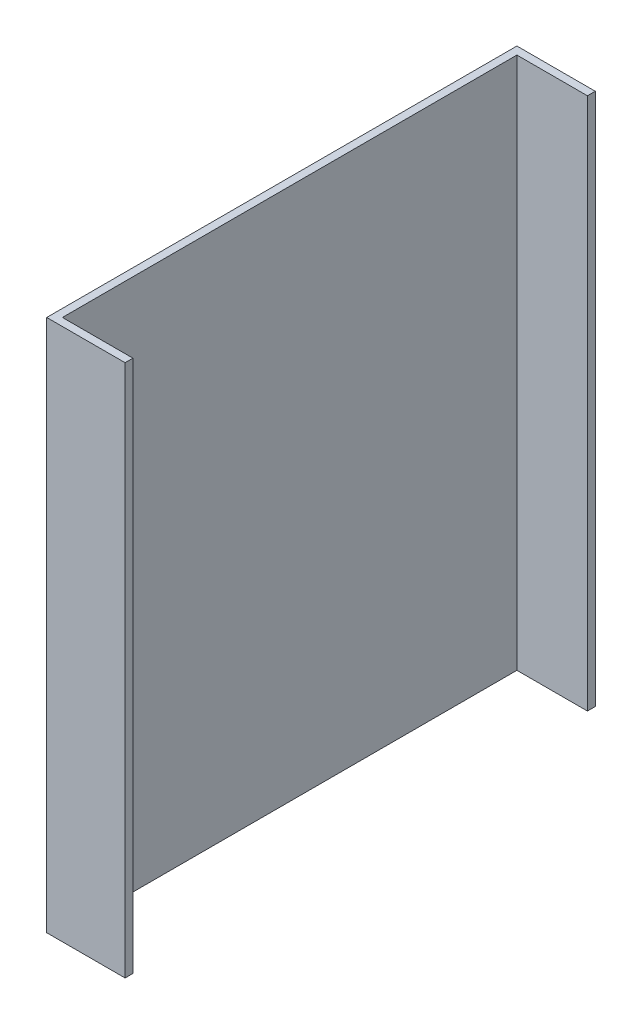
ISO-10303-21;
HEADER;
FILE_DESCRIPTION(('STEP AP214'),'2;1');
FILE_NAME('part.step','',(''),(''),'','','');
FILE_SCHEMA(('AUTOMOTIVE_DESIGN { 1 0 10303 214 1 1 1 1 }'));
ENDSEC;
DATA;
#1=APPLICATION_CONTEXT('core data for automotive mechanical design processes');
#2=APPLICATION_PROTOCOL_DEFINITION('international standard','automotive_design',2000,#1);
#3=PRODUCT_CONTEXT('',#1,'mechanical');
#4=PRODUCT('Part','Part','',(#3));
#5=PRODUCT_RELATED_PRODUCT_CATEGORY('part','',(#4));
#6=PRODUCT_DEFINITION_FORMATION('','',#4);
#7=PRODUCT_DEFINITION_CONTEXT('part definition',#1,'design');
#8=PRODUCT_DEFINITION('design','',#6,#7);
#9=PRODUCT_DEFINITION_SHAPE('','',#8);
#10=(LENGTH_UNIT() NAMED_UNIT(*) SI_UNIT(.MILLI.,.METRE.));
#11=(NAMED_UNIT(*) PLANE_ANGLE_UNIT() SI_UNIT($,.RADIAN.));
#12=(NAMED_UNIT(*) SI_UNIT($,.STERADIAN.) SOLID_ANGLE_UNIT());
#13=UNCERTAINTY_MEASURE_WITH_UNIT(LENGTH_MEASURE(1.E-05),#10,'distance_accuracy_value','');
#14=(GEOMETRIC_REPRESENTATION_CONTEXT(3) GLOBAL_UNCERTAINTY_ASSIGNED_CONTEXT((#13)) GLOBAL_UNIT_ASSIGNED_CONTEXT((#10,
#11,#12)) REPRESENTATION_CONTEXT('',''));
#15=CARTESIAN_POINT('',(0.,0.,0.));
#16=DIRECTION('',(0.,0.,1.));
#17=DIRECTION('',(1.,0.,0.));
#18=AXIS2_PLACEMENT_3D('',#15,#16,#17);
#19=CARTESIAN_POINT('',(32.6228000000035,-43.7918200006,1.19916001190173));
#20=DIRECTION('',(1.02069463991939E-11,1.,5.10341196927923E-12));
#21=DIRECTION('',(0.,5.10341196927923E-12,-1.));
#22=AXIS2_PLACEMENT_3D('',#19,#20,#21);
#23=PLANE('',#22);
#24=DIRECTION('',(-1.,1.02069463991939E-11,0.));
#25=VECTOR('',#24,1.);
#26=CARTESIAN_POINT('',(31.8078000000034,-43.7918200005902,0.909160011901735));
#27=LINE('',#26,#25);
#28=CARTESIAN_POINT('',(31.8978000000034,-43.7918200005912,0.909160011901735));
#29=VERTEX_POINT('',#28);
#30=CARTESIAN_POINT('',(31.8078000000034,-43.7918200005902,0.909160011901735));
#31=VERTEX_POINT('',#30);
#32=EDGE_CURVE('E181',#29,#31,#27,.T.);
#33=ORIENTED_EDGE('',*,*,#32,.F.);
#34=DIRECTION('',(0.,-5.10341196927923E-12,1.));
#35=VECTOR('',#34,1.);
#36=CARTESIAN_POINT('',(31.8978000000034,-43.7918200005912,0.909160011901735));
#37=LINE('',#36,#35);
#38=CARTESIAN_POINT('',(31.8978000000034,-43.7918200005911,0.899160011901735));
#39=VERTEX_POINT('',#38);
#40=EDGE_CURVE('E27',#39,#29,#37,.T.);
#41=ORIENTED_EDGE('',*,*,#40,.F.);
#42=DIRECTION('',(1.,-1.02069463991939E-11,0.));
#43=VECTOR('',#42,1.);
#44=CARTESIAN_POINT('',(31.8978000000034,-43.7918200005911,0.899160011901735));
#45=LINE('',#44,#43);
#46=CARTESIAN_POINT('',(31.7978000000034,-43.7918200005901,0.899160011901735));
#47=VERTEX_POINT('',#46);
#48=EDGE_CURVE('E143',#47,#39,#45,.T.);
#49=ORIENTED_EDGE('',*,*,#48,.F.);
#50=DIRECTION('',(0.,5.10341196927923E-12,-1.));
#51=VECTOR('',#50,1.);
#52=CARTESIAN_POINT('',(31.7978000000034,-43.7918200005901,0.899160011901735));
#53=LINE('',#52,#51);
#54=CARTESIAN_POINT('',(31.7978000000034,-43.7918200005931,1.49916001190173));
#55=VERTEX_POINT('',#54);
#56=EDGE_CURVE('E113',#55,#47,#53,.T.);
#57=ORIENTED_EDGE('',*,*,#56,.F.);
#58=DIRECTION('',(-1.,1.02069463991939E-11,0.));
#59=VECTOR('',#58,1.);
#60=CARTESIAN_POINT('',(31.7978000000034,-43.7918200005931,1.49916001190173));
#61=LINE('',#60,#59);
#62=CARTESIAN_POINT('',(31.8978000000034,-43.7918200005942,1.49916001190173));
#63=VERTEX_POINT('',#62);
#64=EDGE_CURVE('E208',#63,#55,#61,.T.);
#65=ORIENTED_EDGE('',*,*,#64,.F.);
#66=DIRECTION('',(0.,-5.10341196927934E-12,1.));
#67=VECTOR('',#66,1.);
#68=CARTESIAN_POINT('',(31.8978000000034,-43.7918200005942,1.49916001190173));
#69=LINE('',#68,#67);
#70=CARTESIAN_POINT('',(31.8978000000034,-43.7918200005941,1.48916001190173));
#71=VERTEX_POINT('',#70);
#72=EDGE_CURVE('E158',#71,#63,#69,.T.);
#73=ORIENTED_EDGE('',*,*,#72,.F.);
#74=DIRECTION('',(1.,-1.02069463991939E-11,0.));
#75=VECTOR('',#74,1.);
#76=CARTESIAN_POINT('',(31.8978000000034,-43.7918200005941,1.48916001190173));
#77=LINE('',#76,#75);
#78=CARTESIAN_POINT('',(31.8078000000034,-43.7918200005932,1.48916001190173));
#79=VERTEX_POINT('',#78);
#80=EDGE_CURVE('E170',#79,#71,#77,.T.);
#81=ORIENTED_EDGE('',*,*,#80,.F.);
#82=DIRECTION('',(0.,-5.10341196927923E-12,1.));
#83=VECTOR('',#82,1.);
#84=CARTESIAN_POINT('',(31.8078000000034,-43.7918200005932,1.48916001190173));
#85=LINE('',#84,#83);
#86=EDGE_CURVE('E80',#31,#79,#85,.T.);
#87=ORIENTED_EDGE('',*,*,#86,.F.);
#88=EDGE_LOOP('',(#33,#41,#49,#57,#65,#73,#81,#87));
#89=FACE_BOUND('',#88,.T.);
#90=ADVANCED_FACE('F16',(#89),#23,.T.);
#91=CARTESIAN_POINT('',(32.6227999999966,-44.4718200006,1.19916001189826));
#92=DIRECTION('',(1.02069463991939E-11,1.,5.10341196927923E-12));
#93=DIRECTION('',(0.,5.10341196927923E-12,-1.));
#94=AXIS2_PLACEMENT_3D('',#91,#92,#93);
#95=PLANE('',#94);
#96=DIRECTION('',(-1.,1.02069463991939E-11,0.));
#97=VECTOR('',#96,1.);
#98=CARTESIAN_POINT('',(31.8077999999966,-44.4718200005902,0.909160011898265));
#99=LINE('',#98,#97);
#100=CARTESIAN_POINT('',(31.8977999999966,-44.4718200005912,0.909160011898265));
#101=VERTEX_POINT('',#100);
#102=CARTESIAN_POINT('',(31.8077999999966,-44.4718200005902,0.909160011898265));
#103=VERTEX_POINT('',#102);
#104=EDGE_CURVE('E184',#101,#103,#99,.T.);
#105=ORIENTED_EDGE('',*,*,#104,.T.);
#106=DIRECTION('',(0.,-5.10341196927923E-12,1.));
#107=VECTOR('',#106,1.);
#108=CARTESIAN_POINT('',(31.8077999999966,-44.4718200005932,1.48916001189826));
#109=LINE('',#108,#107);
#110=CARTESIAN_POINT('',(31.8077999999966,-44.4718200005932,1.48916001189826));
#111=VERTEX_POINT('',#110);
#112=EDGE_CURVE('E65',#103,#111,#109,.T.);
#113=ORIENTED_EDGE('',*,*,#112,.T.);
#114=DIRECTION('',(1.,-1.02069463991939E-11,0.));
#115=VECTOR('',#114,1.);
#116=CARTESIAN_POINT('',(31.8977999999966,-44.4718200005941,1.48916001189826));
#117=LINE('',#116,#115);
#118=CARTESIAN_POINT('',(31.8977999999966,-44.4718200005941,1.48916001189826));
#119=VERTEX_POINT('',#118);
#120=EDGE_CURVE('E156',#111,#119,#117,.T.);
#121=ORIENTED_EDGE('',*,*,#120,.T.);
#122=DIRECTION('',(0.,-5.10341196927934E-12,1.));
#123=VECTOR('',#122,1.);
#124=CARTESIAN_POINT('',(31.8977999999966,-44.4718200005941,1.49916001189826));
#125=LINE('',#124,#123);
#126=CARTESIAN_POINT('',(31.8977999999966,-44.4718200005941,1.49916001189826));
#127=VERTEX_POINT('',#126);
#128=EDGE_CURVE('E205',#119,#127,#125,.T.);
#129=ORIENTED_EDGE('',*,*,#128,.T.);
#130=DIRECTION('',(-1.,1.02069463991939E-11,0.));
#131=VECTOR('',#130,1.);
#132=CARTESIAN_POINT('',(31.7977999999966,-44.4718200005931,1.49916001189826));
#133=LINE('',#132,#131);
#134=CARTESIAN_POINT('',(31.7977999999966,-44.4718200005931,1.49916001189826));
#135=VERTEX_POINT('',#134);
#136=EDGE_CURVE('E124',#127,#135,#133,.T.);
#137=ORIENTED_EDGE('',*,*,#136,.T.);
#138=DIRECTION('',(0.,5.10341196927923E-12,-1.));
#139=VECTOR('',#138,1.);
#140=CARTESIAN_POINT('',(31.7977999999966,-44.47182000059,0.899160011898265));
#141=LINE('',#140,#139);
#142=CARTESIAN_POINT('',(31.7977999999966,-44.47182000059,0.899160011898265));
#143=VERTEX_POINT('',#142);
#144=EDGE_CURVE('E105',#135,#143,#141,.T.);
#145=ORIENTED_EDGE('',*,*,#144,.T.);
#146=DIRECTION('',(1.,-1.02069463991939E-11,0.));
#147=VECTOR('',#146,1.);
#148=CARTESIAN_POINT('',(31.8977999999966,-44.4718200005911,0.899160011898265));
#149=LINE('',#148,#147);
#150=CARTESIAN_POINT('',(31.8977999999966,-44.4718200005911,0.899160011898265));
#151=VERTEX_POINT('',#150);
#152=EDGE_CURVE('E133',#143,#151,#149,.T.);
#153=ORIENTED_EDGE('',*,*,#152,.T.);
#154=DIRECTION('',(0.,-5.10341196927923E-12,1.));
#155=VECTOR('',#154,1.);
#156=CARTESIAN_POINT('',(31.8977999999966,-44.4718200005912,0.909160011898265));
#157=LINE('',#156,#155);
#158=EDGE_CURVE('E11',#151,#101,#157,.T.);
#159=ORIENTED_EDGE('',*,*,#158,.T.);
#160=EDGE_LOOP('',(#105,#113,#121,#129,#137,#145,#153,#159));
#161=FACE_BOUND('',#160,.T.);
#162=ADVANCED_FACE('F141',(#161),#95,.F.);
#163=CARTESIAN_POINT('',(31.8977999999966,-44.4718200005912,0.909160011898265));
#164=DIRECTION('',(-1.,1.02069463991939E-11,0.));
#165=DIRECTION('',(-1.02069463991939E-11,-1.,-5.10341196927923E-12));
#166=AXIS2_PLACEMENT_3D('',#163,#164,#165);
#167=PLANE('',#166);
#168=ORIENTED_EDGE('',*,*,#40,.T.);
#169=DIRECTION('',(1.02069463991939E-11,1.,5.10341196927923E-12));
#170=VECTOR('',#169,1.);
#171=CARTESIAN_POINT('',(31.8977999999966,-44.4718200005912,0.909160011898265));
#172=LINE('',#171,#170);
#173=EDGE_CURVE('E186',#101,#29,#172,.T.);
#174=ORIENTED_EDGE('',*,*,#173,.F.);
#175=ORIENTED_EDGE('',*,*,#158,.F.);
#176=DIRECTION('',(1.02069463991939E-11,1.,5.10341196927923E-12));
#177=VECTOR('',#176,1.);
#178=CARTESIAN_POINT('',(31.8977999999966,-44.4718200005911,0.899160011898265));
#179=LINE('',#178,#177);
#180=EDGE_CURVE('E137',#151,#39,#179,.T.);
#181=ORIENTED_EDGE('',*,*,#180,.T.);
#182=EDGE_LOOP('',(#168,#174,#175,#181));
#183=FACE_BOUND('',#182,.T.);
#184=ADVANCED_FACE('F242',(#183),#167,.F.);
#185=CARTESIAN_POINT('',(31.8977999999966,-44.4718200005911,0.899160011898265));
#186=DIRECTION('',(0.,-5.10341196927923E-12,1.));
#187=DIRECTION('',(1.,-1.02069463991939E-11,0.));
#188=AXIS2_PLACEMENT_3D('',#185,#186,#187);
#189=PLANE('',#188);
#190=ORIENTED_EDGE('',*,*,#48,.T.);
#191=ORIENTED_EDGE('',*,*,#180,.F.);
#192=ORIENTED_EDGE('',*,*,#152,.F.);
#193=DIRECTION('',(1.02069463991939E-11,1.,5.10341196927923E-12));
#194=VECTOR('',#193,1.);
#195=CARTESIAN_POINT('',(31.7977999999966,-44.47182000059,0.899160011898265));
#196=LINE('',#195,#194);
#197=EDGE_CURVE('E136',#143,#47,#196,.T.);
#198=ORIENTED_EDGE('',*,*,#197,.T.);
#199=EDGE_LOOP('',(#190,#191,#192,#198));
#200=FACE_BOUND('',#199,.T.);
#201=ADVANCED_FACE('F135',(#200),#189,.F.);
#202=CARTESIAN_POINT('',(31.7977999999966,-44.47182000059,0.899160011898265));
#203=DIRECTION('',(1.,-1.02069463991939E-11,0.));
#204=DIRECTION('',(0.,-5.10341196927923E-12,1.));
#205=AXIS2_PLACEMENT_3D('',#202,#203,#204);
#206=PLANE('',#205);
#207=ORIENTED_EDGE('',*,*,#56,.T.);
#208=ORIENTED_EDGE('',*,*,#197,.F.);
#209=ORIENTED_EDGE('',*,*,#144,.F.);
#210=DIRECTION('',(1.02069463991939E-11,1.,5.10341196927923E-12));
#211=VECTOR('',#210,1.);
#212=CARTESIAN_POINT('',(31.7977999999966,-44.4718200005931,1.49916001189826));
#213=LINE('',#212,#211);
#214=EDGE_CURVE('E20',#135,#55,#213,.T.);
#215=ORIENTED_EDGE('',*,*,#214,.T.);
#216=EDGE_LOOP('',(#207,#208,#209,#215));
#217=FACE_BOUND('',#216,.T.);
#218=ADVANCED_FACE('F145',(#217),#206,.F.);
#219=CARTESIAN_POINT('',(31.7977999999966,-44.4718200005931,1.49916001189826));
#220=DIRECTION('',(0.,5.10341196927923E-12,-1.));
#221=DIRECTION('',(1.02069463991939E-11,1.,5.10341196927923E-12));
#222=AXIS2_PLACEMENT_3D('',#219,#220,#221);
#223=PLANE('',#222);
#224=ORIENTED_EDGE('',*,*,#64,.T.);
#225=ORIENTED_EDGE('',*,*,#214,.F.);
#226=ORIENTED_EDGE('',*,*,#136,.F.);
#227=DIRECTION('',(1.02069463991939E-11,1.,5.10341196927923E-12));
#228=VECTOR('',#227,1.);
#229=CARTESIAN_POINT('',(31.8977999999966,-44.4718200005941,1.49916001189826));
#230=LINE('',#229,#228);
#231=EDGE_CURVE('E166',#127,#63,#230,.T.);
#232=ORIENTED_EDGE('',*,*,#231,.T.);
#233=EDGE_LOOP('',(#224,#225,#226,#232));
#234=FACE_BOUND('',#233,.T.);
#235=ADVANCED_FACE('F224',(#234),#223,.F.);
#236=CARTESIAN_POINT('',(31.8977999999966,-44.4718200005941,1.49916001189826));
#237=DIRECTION('',(-1.,1.02069463991938E-11,0.));
#238=DIRECTION('',(-1.02069463991939E-11,-1.,-5.10341196927923E-12));
#239=AXIS2_PLACEMENT_3D('',#236,#237,#238);
#240=PLANE('',#239);
#241=ORIENTED_EDGE('',*,*,#72,.T.);
#242=ORIENTED_EDGE('',*,*,#231,.F.);
#243=ORIENTED_EDGE('',*,*,#128,.F.);
#244=DIRECTION('',(1.02069463991939E-11,1.,5.10341196927923E-12));
#245=VECTOR('',#244,1.);
#246=CARTESIAN_POINT('',(31.8977999999966,-44.4718200005941,1.48916001189826));
#247=LINE('',#246,#245);
#248=EDGE_CURVE('E159',#119,#71,#247,.T.);
#249=ORIENTED_EDGE('',*,*,#248,.T.);
#250=EDGE_LOOP('',(#241,#242,#243,#249));
#251=FACE_BOUND('',#250,.T.);
#252=ADVANCED_FACE('F226',(#251),#240,.F.);
#253=CARTESIAN_POINT('',(31.8977999999966,-44.4718200005941,1.48916001189826));
#254=DIRECTION('',(0.,-5.10341196927923E-12,1.));
#255=DIRECTION('',(1.,-1.02069463991939E-11,0.));
#256=AXIS2_PLACEMENT_3D('',#253,#254,#255);
#257=PLANE('',#256);
#258=ORIENTED_EDGE('',*,*,#80,.T.);
#259=ORIENTED_EDGE('',*,*,#248,.F.);
#260=ORIENTED_EDGE('',*,*,#120,.F.);
#261=DIRECTION('',(1.02069463991939E-11,1.,5.10341196927923E-12));
#262=VECTOR('',#261,1.);
#263=CARTESIAN_POINT('',(31.8077999999966,-44.4718200005932,1.48916001189826));
#264=LINE('',#263,#262);
#265=EDGE_CURVE('E190',#111,#79,#264,.T.);
#266=ORIENTED_EDGE('',*,*,#265,.T.);
#267=EDGE_LOOP('',(#258,#259,#260,#266));
#268=FACE_BOUND('',#267,.T.);
#269=ADVANCED_FACE('F18',(#268),#257,.F.);
#270=CARTESIAN_POINT('',(31.8077999999966,-44.4718200005932,1.48916001189826));
#271=DIRECTION('',(-1.,1.02069463991939E-11,0.));
#272=DIRECTION('',(-1.02069463991939E-11,-1.,-5.10341196927923E-12));
#273=AXIS2_PLACEMENT_3D('',#270,#271,#272);
#274=PLANE('',#273);
#275=ORIENTED_EDGE('',*,*,#86,.T.);
#276=ORIENTED_EDGE('',*,*,#265,.F.);
#277=ORIENTED_EDGE('',*,*,#112,.F.);
#278=DIRECTION('',(1.02069463991939E-11,1.,5.10341196927923E-12));
#279=VECTOR('',#278,1.);
#280=CARTESIAN_POINT('',(31.8077999999966,-44.4718200005902,0.909160011898265));
#281=LINE('',#280,#279);
#282=EDGE_CURVE('E187',#103,#31,#281,.T.);
#283=ORIENTED_EDGE('',*,*,#282,.T.);
#284=EDGE_LOOP('',(#275,#276,#277,#283));
#285=FACE_BOUND('',#284,.T.);
#286=ADVANCED_FACE('F248',(#285),#274,.F.);
#287=CARTESIAN_POINT('',(31.8077999999966,-44.4718200005902,0.909160011898265));
#288=DIRECTION('',(0.,5.10341196927923E-12,-1.));
#289=DIRECTION('',(1.02069463991939E-11,1.,5.10341196927923E-12));
#290=AXIS2_PLACEMENT_3D('',#287,#288,#289);
#291=PLANE('',#290);
#292=ORIENTED_EDGE('',*,*,#32,.T.);
#293=ORIENTED_EDGE('',*,*,#282,.F.);
#294=ORIENTED_EDGE('',*,*,#104,.F.);
#295=ORIENTED_EDGE('',*,*,#173,.T.);
#296=EDGE_LOOP('',(#292,#293,#294,#295));
#297=FACE_BOUND('',#296,.T.);
#298=ADVANCED_FACE('F246',(#297),#291,.F.);
#299=CLOSED_SHELL('',(#90,#162,#184,#201,#218,#235,#252,#269,#286,#298));
#300=MANIFOLD_SOLID_BREP('B1',#299);
#301=ADVANCED_BREP_SHAPE_REPRESENTATION('',(#18,#300),#14);
#302=SHAPE_DEFINITION_REPRESENTATION(#9,#301);
ENDSEC;
END-ISO-10303-21;
